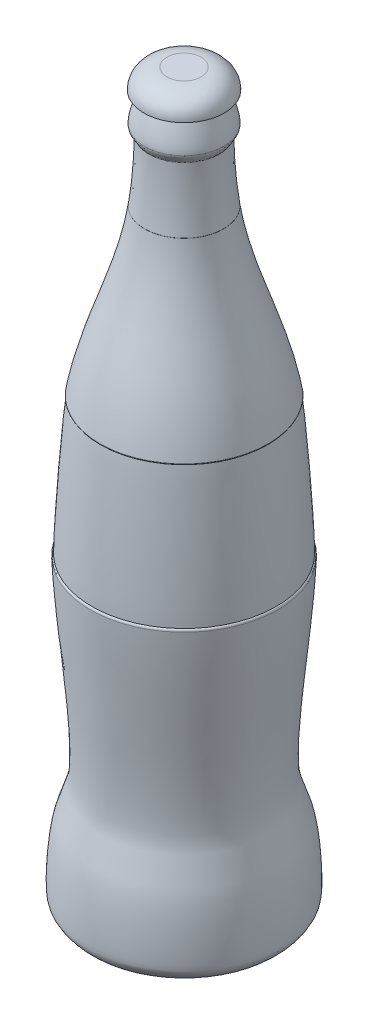
ISO-10303-21;
HEADER;
FILE_DESCRIPTION(('STEP AP214'),'2;1');
FILE_NAME('part.step','',(''),(''),'','','');
FILE_SCHEMA(('AUTOMOTIVE_DESIGN { 1 0 10303 214 1 1 1 1 }'));
ENDSEC;
DATA;
#1=APPLICATION_CONTEXT('core data for automotive mechanical design processes');
#2=APPLICATION_PROTOCOL_DEFINITION('international standard','automotive_design',2000,#1);
#3=PRODUCT_CONTEXT('',#1,'mechanical');
#4=PRODUCT('Part','Part','',(#3));
#5=PRODUCT_RELATED_PRODUCT_CATEGORY('part','',(#4));
#6=PRODUCT_DEFINITION_FORMATION('','',#4);
#7=PRODUCT_DEFINITION_CONTEXT('part definition',#1,'design');
#8=PRODUCT_DEFINITION('design','',#6,#7);
#9=PRODUCT_DEFINITION_SHAPE('','',#8);
#10=(LENGTH_UNIT() NAMED_UNIT(*) SI_UNIT(.MILLI.,.METRE.));
#11=(NAMED_UNIT(*) PLANE_ANGLE_UNIT() SI_UNIT($,.RADIAN.));
#12=(NAMED_UNIT(*) SI_UNIT($,.STERADIAN.) SOLID_ANGLE_UNIT());
#13=UNCERTAINTY_MEASURE_WITH_UNIT(LENGTH_MEASURE(1.E-05),#10,'distance_accuracy_value','');
#14=(GEOMETRIC_REPRESENTATION_CONTEXT(3) GLOBAL_UNCERTAINTY_ASSIGNED_CONTEXT((#13)) GLOBAL_UNIT_ASSIGNED_CONTEXT((#10,
#11,#12)) REPRESENTATION_CONTEXT('',''));
#15=CARTESIAN_POINT('',(0.,0.,0.));
#16=DIRECTION('',(0.,0.,1.));
#17=DIRECTION('',(1.,0.,0.));
#18=AXIS2_PLACEMENT_3D('',#15,#16,#17);
#19=CARTESIAN_POINT('',(66.4763712833562,72.4020191366919,0.));
#20=CARTESIAN_POINT('',(66.4763712833562,69.970680001627,0.));
#21=CARTESIAN_POINT('',(66.159035292519,65.6838279452478,0.));
#22=CARTESIAN_POINT('',(64.1594743848435,57.2534538323688,0.));
#23=CARTESIAN_POINT('',(62.2478166885655,53.6712313480061,0.));
#24=CARTESIAN_POINT('',(61.2572416574406,48.231375414033,0.));
#25=B_SPLINE_CURVE_WITH_KNOTS('',3,(#19,#20,#21,#22,#23,#24),.UNSPECIFIED.,.F.,.F.,(4,1,1,4),
(0.,0.259252545558893,0.359252545558893,1.),.UNSPECIFIED.);
#26=CARTESIAN_POINT('',(70.2369282003699,0.72855248004856,0.));
#27=DIRECTION('',(0.,-1.,0.));
#28=AXIS1_PLACEMENT('',#26,#27);
#29=SURFACE_OF_REVOLUTION('',#25,#28);
#30=CARTESIAN_POINT('',(70.2369282003699,65.7285524800486,0.));
#31=DIRECTION('',(0.,-1.,0.));
#32=DIRECTION('',(0.,0.,-1.));
#33=AXIS2_PLACEMENT_3D('',#30,#31,#32);
#34=CIRCLE('',#33,4.22287871252683);
#35=CARTESIAN_POINT('',(70.2369282003699,65.7285524800486,-4.22287871252683));
#36=VERTEX_POINT('',#35);
#37=EDGE_CURVE('E125',#36,#36,#34,.T.);
#38=ORIENTED_EDGE('',*,*,#37,.T.);
#39=EDGE_LOOP('',(#38));
#40=FACE_BOUND('',#39,.T.);
#41=CARTESIAN_POINT('',(70.2369282003699,48.231375414033,0.));
#42=DIRECTION('',(0.,-1.,0.));
#43=DIRECTION('',(0.,0.,-1.));
#44=AXIS2_PLACEMENT_3D('',#41,#42,#43);
#45=CIRCLE('',#44,8.97968654292935);
#46=CARTESIAN_POINT('',(70.2369282003699,48.231375414033,-8.97968654292935));
#47=VERTEX_POINT('',#46);
#48=EDGE_CURVE('E122',#47,#47,#45,.T.);
#49=ORIENTED_EDGE('',*,*,#48,.F.);
#50=EDGE_LOOP('',(#49));
#51=FACE_BOUND('',#50,.T.);
#52=ADVANCED_FACE('F55',(#40,#51),#29,.T.);
#53=CARTESIAN_POINT('',(61.2572416574406,48.231375414033,0.));
#54=CARTESIAN_POINT('',(61.2490684883076,48.1864915221415,0.));
#55=CARTESIAN_POINT('',(61.2847325428523,48.1221941082066,0.));
#56=CARTESIAN_POINT('',(61.3340001059562,48.0957200853214,0.));
#57=B_SPLINE_CURVE_WITH_KNOTS('',3,(#53,#54,#55,#56),.UNSPECIFIED.,.F.,.F.,(4,4),(0.,1.),.UNSPECIFIED.);
#58=CARTESIAN_POINT('',(70.2369282003699,0.72855248004856,0.));
#59=DIRECTION('',(0.,-1.,0.));
#60=AXIS1_PLACEMENT('',#58,#59);
#61=SURFACE_OF_REVOLUTION('',#57,#60);
#62=CARTESIAN_POINT('',(70.2369282003699,48.0957200853214,0.));
#63=DIRECTION('',(0.,-1.,0.));
#64=DIRECTION('',(0.,0.,-1.));
#65=AXIS2_PLACEMENT_3D('',#62,#63,#64);
#66=CIRCLE('',#65,8.90292809441377);
#67=CARTESIAN_POINT('',(70.2369282003699,48.0957200853214,-8.90292809441377));
#68=VERTEX_POINT('',#67);
#69=EDGE_CURVE('E119',#68,#68,#66,.T.);
#70=ORIENTED_EDGE('',*,*,#69,.F.);
#71=EDGE_LOOP('',(#70));
#72=FACE_BOUND('',#71,.T.);
#73=ORIENTED_EDGE('',*,*,#48,.T.);
#74=EDGE_LOOP('',(#73));
#75=FACE_BOUND('',#74,.T.);
#76=ADVANCED_FACE('F83',(#72,#75),#61,.T.);
#77=CARTESIAN_POINT('',(61.3340001059562,48.0957200853214,0.));
#78=CARTESIAN_POINT('',(61.0043326396073,45.4968319087952,0.));
#79=CARTESIAN_POINT('',(60.4211683923572,37.1033249087996,0.));
#80=CARTESIAN_POINT('',(60.3713755204647,33.6282651790635,0.));
#81=B_SPLINE_CURVE_WITH_KNOTS('',3,(#77,#78,#79,#80),.UNSPECIFIED.,.F.,.F.,(4,4),(0.,1.),.UNSPECIFIED.);
#82=CARTESIAN_POINT('',(70.2369282003699,0.72855248004856,0.));
#83=DIRECTION('',(0.,-1.,0.));
#84=AXIS1_PLACEMENT('',#82,#83);
#85=SURFACE_OF_REVOLUTION('',#81,#84);
#86=CARTESIAN_POINT('',(70.2369282003699,33.6282651790635,0.));
#87=DIRECTION('',(0.,-1.,0.));
#88=DIRECTION('',(0.,0.,-1.));
#89=AXIS2_PLACEMENT_3D('',#86,#87,#88);
#90=CIRCLE('',#89,9.86555267990523);
#91=CARTESIAN_POINT('',(70.2369282003699,33.6282651790635,-9.86555267990523));
#92=VERTEX_POINT('',#91);
#93=EDGE_CURVE('E116',#92,#92,#90,.T.);
#94=ORIENTED_EDGE('',*,*,#93,.F.);
#95=EDGE_LOOP('',(#94));
#96=FACE_BOUND('',#95,.T.);
#97=ORIENTED_EDGE('',*,*,#69,.T.);
#98=EDGE_LOOP('',(#97));
#99=FACE_BOUND('',#98,.T.);
#100=ADVANCED_FACE('F86',(#96,#99),#85,.T.);
#101=CARTESIAN_POINT('',(60.3713755204647,33.6282651790635,0.));
#102=CARTESIAN_POINT('',(60.2693891588103,33.5907470665881,0.));
#103=CARTESIAN_POINT('',(60.2336621783355,33.4939523241539,0.));
#104=CARTESIAN_POINT('',(60.2320783828625,33.3789914486554,0.));
#105=B_SPLINE_CURVE_WITH_KNOTS('',3,(#101,#102,#103,#104),.UNSPECIFIED.,.F.,.F.,(4,4),(0.,1.),.UNSPECIFIED.);
#106=CARTESIAN_POINT('',(70.2369282003699,0.72855248004856,0.));
#107=DIRECTION('',(0.,-1.,0.));
#108=AXIS1_PLACEMENT('',#106,#107);
#109=SURFACE_OF_REVOLUTION('',#105,#108);
#110=CARTESIAN_POINT('',(70.2369282003699,33.3789914486555,0.));
#111=DIRECTION('',(0.,-1.,0.));
#112=DIRECTION('',(0.,0.,-1.));
#113=AXIS2_PLACEMENT_3D('',#110,#111,#112);
#114=CIRCLE('',#113,10.0048498175074);
#115=CARTESIAN_POINT('',(70.2369282003699,33.3789914486555,-10.0048498175074));
#116=VERTEX_POINT('',#115);
#117=EDGE_CURVE('E113',#116,#116,#114,.T.);
#118=ORIENTED_EDGE('',*,*,#117,.F.);
#119=EDGE_LOOP('',(#118));
#120=FACE_BOUND('',#119,.T.);
#121=ORIENTED_EDGE('',*,*,#93,.T.);
#122=EDGE_LOOP('',(#121));
#123=FACE_BOUND('',#122,.T.);
#124=ADVANCED_FACE('F90',(#120,#123),#109,.T.);
#125=CARTESIAN_POINT('',(61.71743143264,0.728552480048556,0.));
#126=CARTESIAN_POINT('',(60.7515469128014,0.728552480048556,0.));
#127=CARTESIAN_POINT('',(60.1104345855611,1.62709394411711,0.));
#128=CARTESIAN_POINT('',(59.7378366389541,2.47037630368479,0.));
#129=CARTESIAN_POINT('',(59.8897294937572,8.94065068787875,0.));
#130=CARTESIAN_POINT('',(61.5165420343383,11.9949724903344,0.));
#131=CARTESIAN_POINT('',(61.796939402568,19.0443668987478,0.));
#132=CARTESIAN_POINT('',(60.5449633004178,26.3685359652526,0.));
#133=CARTESIAN_POINT('',(60.2320783828625,33.3789914486555,0.));
#134=B_SPLINE_CURVE_WITH_KNOTS('',3,(#125,#126,#127,#128,#129,#130,#131,#132,#133),
.UNSPECIFIED.,.F.,.F.,(4,1,1,1,1,1,4),(0.,0.208168804237619,0.249427648620693,0.412588443830744,
0.515443911994493,0.574185067611419,1.),.UNSPECIFIED.);
#135=CARTESIAN_POINT('',(70.2369282003699,0.72855248004856,0.));
#136=DIRECTION('',(0.,-1.,0.));
#137=AXIS1_PLACEMENT('',#135,#136);
#138=SURFACE_OF_REVOLUTION('',#134,#137);
#139=ORIENTED_EDGE('',*,*,#117,.T.);
#140=EDGE_LOOP('',(#139));
#141=FACE_BOUND('',#140,.T.);
#142=CARTESIAN_POINT('',(70.2369282003699,0.728552480048556,0.));
#143=DIRECTION('',(0.,-1.,0.));
#144=DIRECTION('',(0.,0.,-1.));
#145=AXIS2_PLACEMENT_3D('',#142,#143,#144);
#146=CIRCLE('',#145,8.51949676772999);
#147=CARTESIAN_POINT('',(70.2369282003699,0.728552480048556,-8.51949676772999));
#148=VERTEX_POINT('',#147);
#149=EDGE_CURVE('E68',#148,#148,#146,.T.);
#150=ORIENTED_EDGE('',*,*,#149,.F.);
#151=EDGE_LOOP('',(#150));
#152=FACE_BOUND('',#151,.T.);
#153=ADVANCED_FACE('F94',(#141,#152),#138,.F.);
#154=CARTESIAN_POINT('',(0.,0.728552480048558,0.));
#155=DIRECTION('',(0.,1.,0.));
#156=DIRECTION('',(0.,0.,1.));
#157=AXIS2_PLACEMENT_3D('',#154,#155,#156);
#158=PLANE('',#157);
#159=CARTESIAN_POINT('',(70.2369282003699,0.728552480048558,0.));
#160=DIRECTION('',(0.,-1.,0.));
#161=DIRECTION('',(0.,0.,-1.));
#162=AXIS2_PLACEMENT_3D('',#159,#160,#161);
#163=CIRCLE('',#162,0.499999999999999);
#164=CARTESIAN_POINT('',(70.2369282003699,0.728552480048558,-0.499999999999999));
#165=VERTEX_POINT('',#164);
#166=EDGE_CURVE('E64',#165,#165,#163,.T.);
#167=ORIENTED_EDGE('',*,*,#166,.F.);
#168=EDGE_LOOP('',(#167));
#169=FACE_BOUND('',#168,.T.);
#170=ORIENTED_EDGE('',*,*,#149,.T.);
#171=EDGE_LOOP('',(#170));
#172=FACE_BOUND('',#171,.T.);
#173=ADVANCED_FACE('F160',(#169,#172),#158,.F.);
#174=CARTESIAN_POINT('',(70.2369282003699,1.12855248004856,0.));
#175=DIRECTION('',(0.,-1.,0.));
#176=DIRECTION('',(0.,0.,-1.));
#177=AXIS2_PLACEMENT_3D('',#174,#175,#176);
#178=CYLINDRICAL_SURFACE('',#177,0.499999999999999);
#179=CARTESIAN_POINT('',(70.2369282003699,1.12855248004856,0.));
#180=DIRECTION('',(0.,-1.,0.));
#181=DIRECTION('',(0.,0.,-1.));
#182=AXIS2_PLACEMENT_3D('',#179,#180,#181);
#183=CIRCLE('',#182,0.499999999999999);
#184=CARTESIAN_POINT('',(70.2369282003699,1.12855248004856,-0.499999999999999));
#185=VERTEX_POINT('',#184);
#186=EDGE_CURVE('E11',#185,#185,#183,.T.);
#187=ORIENTED_EDGE('',*,*,#186,.F.);
#188=EDGE_LOOP('',(#187));
#189=FACE_BOUND('',#188,.T.);
#190=ORIENTED_EDGE('',*,*,#166,.T.);
#191=EDGE_LOOP('',(#190));
#192=FACE_BOUND('',#191,.T.);
#193=ADVANCED_FACE('F137',(#189,#192),#178,.F.);
#194=CARTESIAN_POINT('',(70.2369282003699,1.12855248004856,0.));
#195=DIRECTION('',(0.,-1.,0.));
#196=DIRECTION('',(0.,0.,-1.));
#197=AXIS2_PLACEMENT_3D('',#194,#195,#196);
#198=PLANE('',#197);
#199=ORIENTED_EDGE('',*,*,#186,.T.);
#200=EDGE_LOOP('',(#199));
#201=FACE_BOUND('',#200,.T.);
#202=ADVANCED_FACE('F133',(#201),#198,.T.);
#203=CARTESIAN_POINT('',(70.2369282003699,65.7285524800486,0.));
#204=DIRECTION('',(0.,-1.,0.));
#205=DIRECTION('',(0.,0.,-1.));
#206=AXIS2_PLACEMENT_3D('',#203,#204,#205);
#207=PLANE('',#206);
#208=ORIENTED_EDGE('',*,*,#37,.F.);
#209=EDGE_LOOP('',(#208));
#210=FACE_BOUND('',#209,.T.);
#211=ADVANCED_FACE('F131',(#210),#207,.F.);
#212=CLOSED_SHELL('',(#52,#76,#100,#124,#153,#173,#193,#202,#211));
#213=MANIFOLD_SOLID_BREP('B2',#212);
#214=CARTESIAN_POINT('',(0.,78.5883370767875,0.));
#215=DIRECTION('',(0.,1.,0.));
#216=DIRECTION('',(0.,0.,1.));
#217=AXIS2_PLACEMENT_3D('',#214,#215,#216);
#218=PLANE('',#217);
#219=CARTESIAN_POINT('',(70.2369282003699,78.5883370767875,0.));
#220=DIRECTION('',(0.,-1.,0.));
#221=DIRECTION('',(0.,0.,-1.));
#222=AXIS2_PLACEMENT_3D('',#219,#220,#221);
#223=CIRCLE('',#222,1.82746017712372);
#224=CARTESIAN_POINT('',(70.2369282003699,78.5883370767875,-1.82746017712372));
#225=VERTEX_POINT('',#224);
#226=EDGE_CURVE('E54',#225,#225,#223,.T.);
#227=ORIENTED_EDGE('',*,*,#226,.F.);
#228=EDGE_LOOP('',(#227));
#229=FACE_BOUND('',#228,.T.);
#230=ADVANCED_FACE('F275',(#229),#218,.T.);
#231=CARTESIAN_POINT('',(68.4094680232462,78.5883370767875,0.));
#232=CARTESIAN_POINT('',(67.1552839184113,78.5883370767875,0.));
#233=CARTESIAN_POINT('',(65.9492629339348,77.8519844063791,0.));
#234=CARTESIAN_POINT('',(65.9492629339347,76.4714046443598,0.));
#235=B_SPLINE_CURVE_WITH_KNOTS('',3,(#231,#232,#233,#234),.UNSPECIFIED.,.F.,.F.,(4,4),(0.,1.),.UNSPECIFIED.);
#236=CARTESIAN_POINT('',(70.2369282003699,0.72855248004856,0.));
#237=DIRECTION('',(0.,-1.,0.));
#238=AXIS1_PLACEMENT('',#236,#237);
#239=SURFACE_OF_REVOLUTION('',#235,#238);
#240=CARTESIAN_POINT('',(70.2369282003699,76.4714046443598,0.));
#241=DIRECTION('',(0.,-1.,0.));
#242=DIRECTION('',(0.,0.,-1.));
#243=AXIS2_PLACEMENT_3D('',#240,#241,#242);
#244=CIRCLE('',#243,4.2876652664352);
#245=CARTESIAN_POINT('',(70.2369282003699,76.4714046443598,-4.2876652664352));
#246=VERTEX_POINT('',#245);
#247=EDGE_CURVE('E282',#246,#246,#244,.T.);
#248=ORIENTED_EDGE('',*,*,#247,.F.);
#249=EDGE_LOOP('',(#248));
#250=FACE_BOUND('',#249,.T.);
#251=ORIENTED_EDGE('',*,*,#226,.T.);
#252=EDGE_LOOP('',(#251));
#253=FACE_BOUND('',#252,.T.);
#254=ADVANCED_FACE('F337',(#250,#253),#239,.T.);
#255=CARTESIAN_POINT('',(0.,76.4714046443598,0.));
#256=DIRECTION('',(0.,1.,0.));
#257=DIRECTION('',(0.,0.,1.));
#258=AXIS2_PLACEMENT_3D('',#255,#256,#257);
#259=PLANE('',#258);
#260=CARTESIAN_POINT('',(70.2369282003699,76.4714046443598,0.));
#261=DIRECTION('',(0.,-1.,0.));
#262=DIRECTION('',(0.,0.,-1.));
#263=AXIS2_PLACEMENT_3D('',#260,#261,#262);
#264=CIRCLE('',#263,3.39744616580165);
#265=CARTESIAN_POINT('',(70.2369282003699,76.4714046443598,-3.39744616580165));
#266=VERTEX_POINT('',#265);
#267=EDGE_CURVE('E286',#266,#266,#264,.T.);
#268=ORIENTED_EDGE('',*,*,#267,.F.);
#269=EDGE_LOOP('',(#268));
#270=FACE_BOUND('',#269,.T.);
#271=ORIENTED_EDGE('',*,*,#247,.T.);
#272=EDGE_LOOP('',(#271));
#273=FACE_BOUND('',#272,.T.);
#274=ADVANCED_FACE('F322',(#270,#273),#259,.F.);
#275=CARTESIAN_POINT('',(65.9996473431409,73.3703067199292,0.));
#276=CARTESIAN_POINT('',(65.9996473431409,74.1970743786341,0.));
#277=CARTESIAN_POINT('',(66.8394820345683,76.4714046443598,0.));
#278=B_SPLINE_CURVE_WITH_KNOTS('',2,(#275,#276,#277),.UNSPECIFIED.,.F.,.F.,(3,3),(0.,1.),.UNSPECIFIED.);
#279=CARTESIAN_POINT('',(70.2369282003699,0.72855248004856,0.));
#280=DIRECTION('',(0.,-1.,0.));
#281=AXIS1_PLACEMENT('',#279,#280);
#282=SURFACE_OF_REVOLUTION('',#278,#281);
#283=ORIENTED_EDGE('',*,*,#267,.T.);
#284=EDGE_LOOP('',(#283));
#285=FACE_BOUND('',#284,.T.);
#286=CARTESIAN_POINT('',(70.2369282003699,73.3703067199292,0.));
#287=DIRECTION('',(0.,-1.,0.));
#288=DIRECTION('',(0.,0.,-1.));
#289=AXIS2_PLACEMENT_3D('',#286,#287,#288);
#290=CIRCLE('',#289,4.23728085722903);
#291=CARTESIAN_POINT('',(70.2369282003699,73.3703067199292,-4.23728085722903));
#292=VERTEX_POINT('',#291);
#293=EDGE_CURVE('E291',#292,#292,#290,.T.);
#294=ORIENTED_EDGE('',*,*,#293,.F.);
#295=EDGE_LOOP('',(#294));
#296=FACE_BOUND('',#295,.T.);
#297=ADVANCED_FACE('F318',(#285,#296),#282,.F.);
#298=CARTESIAN_POINT('',(65.9996473431409,73.3703067199292,0.));
#299=CARTESIAN_POINT('',(65.9996473431409,73.0590923032667,0.));
#300=CARTESIAN_POINT('',(66.4763712833562,72.5292633260498,0.));
#301=CARTESIAN_POINT('',(66.4763712833562,72.4020191366919,0.));
#302=B_SPLINE_CURVE_WITH_KNOTS('',3,(#298,#299,#300,#301),.UNSPECIFIED.,.F.,.F.,(4,4),(0.,1.),.UNSPECIFIED.);
#303=CARTESIAN_POINT('',(70.2369282003699,0.72855248004856,0.));
#304=DIRECTION('',(0.,-1.,0.));
#305=AXIS1_PLACEMENT('',#303,#304);
#306=SURFACE_OF_REVOLUTION('',#302,#305);
#307=CARTESIAN_POINT('',(70.2369282003699,72.4020191366919,0.));
#308=DIRECTION('',(0.,-1.,0.));
#309=DIRECTION('',(0.,0.,-1.));
#310=AXIS2_PLACEMENT_3D('',#307,#308,#309);
#311=CIRCLE('',#310,3.76055691701373);
#312=CARTESIAN_POINT('',(70.2369282003699,72.4020191366919,-3.76055691701373));
#313=VERTEX_POINT('',#312);
#314=EDGE_CURVE('E294',#313,#313,#311,.T.);
#315=ORIENTED_EDGE('',*,*,#314,.F.);
#316=EDGE_LOOP('',(#315));
#317=FACE_BOUND('',#316,.T.);
#318=ORIENTED_EDGE('',*,*,#293,.T.);
#319=EDGE_LOOP('',(#318));
#320=FACE_BOUND('',#319,.T.);
#321=ADVANCED_FACE('F314',(#317,#320),#306,.T.);
#322=CARTESIAN_POINT('',(66.4763712833562,72.4020191366919,0.));
#323=CARTESIAN_POINT('',(66.4763712833562,69.970680001627,0.));
#324=CARTESIAN_POINT('',(66.159035292519,65.6838279452478,0.));
#325=CARTESIAN_POINT('',(64.1594743848435,57.2534538323688,0.));
#326=CARTESIAN_POINT('',(62.2478166885655,53.6712313480061,0.));
#327=CARTESIAN_POINT('',(61.2572416574406,48.231375414033,0.));
#328=B_SPLINE_CURVE_WITH_KNOTS('',3,(#322,#323,#324,#325,#326,#327),.UNSPECIFIED.,.F.,.F.,(4,1,
1,4),(0.,0.259252545558893,0.359252545558893,1.),.UNSPECIFIED.);
#329=CARTESIAN_POINT('',(70.2369282003699,0.72855248004856,0.));
#330=DIRECTION('',(0.,-1.,0.));
#331=AXIS1_PLACEMENT('',#329,#330);
#332=SURFACE_OF_REVOLUTION('',#328,#331);
#333=ORIENTED_EDGE('',*,*,#314,.T.);
#334=EDGE_LOOP('',(#333));
#335=FACE_BOUND('',#334,.T.);
#336=CARTESIAN_POINT('',(70.2369282003699,65.7385524800486,0.));
#337=DIRECTION('',(0.,-1.,0.));
#338=DIRECTION('',(0.,0.,-1.));
#339=AXIS2_PLACEMENT_3D('',#336,#337,#338);
#340=CIRCLE('',#339,4.22148266676504);
#341=CARTESIAN_POINT('',(70.2369282003699,65.7385524800486,-4.22148266676504));
#342=VERTEX_POINT('',#341);
#343=EDGE_CURVE('E278',#342,#342,#340,.T.);
#344=ORIENTED_EDGE('',*,*,#343,.F.);
#345=EDGE_LOOP('',(#344));
#346=FACE_BOUND('',#345,.T.);
#347=ADVANCED_FACE('F309',(#335,#346),#332,.T.);
#348=CARTESIAN_POINT('',(70.2369282003699,65.7385524800486,0.));
#349=DIRECTION('',(0.,-1.,0.));
#350=DIRECTION('',(0.,0.,-1.));
#351=AXIS2_PLACEMENT_3D('',#348,#349,#350);
#352=PLANE('',#351);
#353=ORIENTED_EDGE('',*,*,#343,.T.);
#354=EDGE_LOOP('',(#353));
#355=FACE_BOUND('',#354,.T.);
#356=ADVANCED_FACE('F313',(#355),#352,.T.);
#357=CLOSED_SHELL('',(#230,#254,#274,#297,#321,#347,#356));
#358=MANIFOLD_SOLID_BREP('B6',#357);
#359=ADVANCED_BREP_SHAPE_REPRESENTATION('',(#18,#213,#358),#14);
#360=SHAPE_DEFINITION_REPRESENTATION(#9,#359);
ENDSEC;
END-ISO-10303-21;
